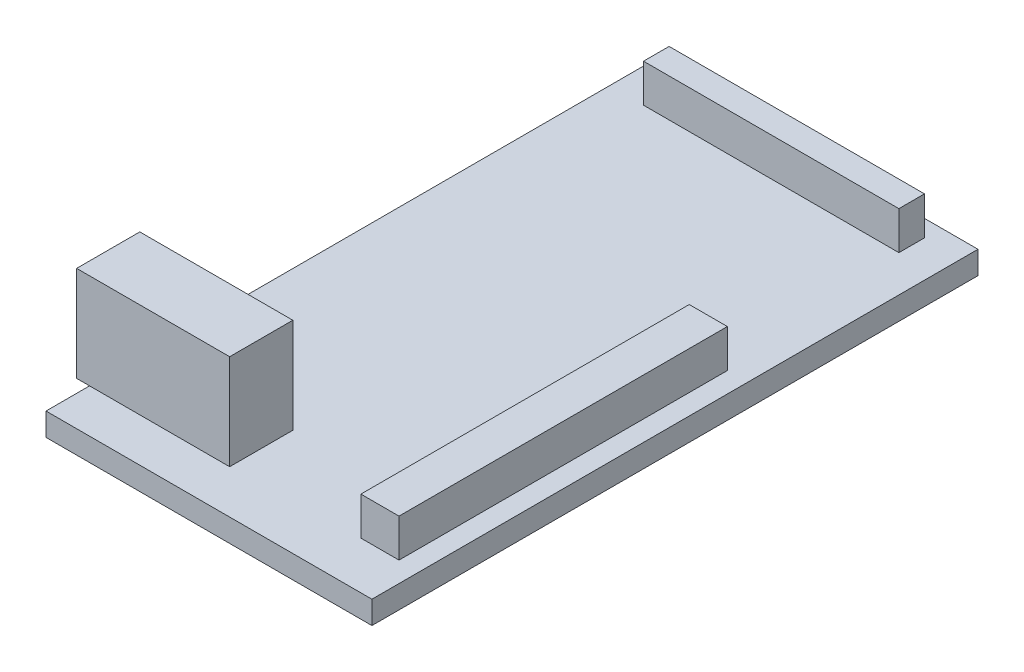
ISO-10303-21;
HEADER;
FILE_DESCRIPTION(('STEP AP214'),'2;1');
FILE_NAME('part.step','',(''),(''),'','','');
FILE_SCHEMA(('AUTOMOTIVE_DESIGN { 1 0 10303 214 1 1 1 1 }'));
ENDSEC;
DATA;
#1=APPLICATION_CONTEXT('core data for automotive mechanical design processes');
#2=APPLICATION_PROTOCOL_DEFINITION('international standard','automotive_design',2000,#1);
#3=PRODUCT_CONTEXT('',#1,'mechanical');
#4=PRODUCT('Part','Part','',(#3));
#5=PRODUCT_RELATED_PRODUCT_CATEGORY('part','',(#4));
#6=PRODUCT_DEFINITION_FORMATION('','',#4);
#7=PRODUCT_DEFINITION_CONTEXT('part definition',#1,'design');
#8=PRODUCT_DEFINITION('design','',#6,#7);
#9=PRODUCT_DEFINITION_SHAPE('','',#8);
#10=(LENGTH_UNIT() NAMED_UNIT(*) SI_UNIT(.MILLI.,.METRE.));
#11=(NAMED_UNIT(*) PLANE_ANGLE_UNIT() SI_UNIT($,.RADIAN.));
#12=(NAMED_UNIT(*) SI_UNIT($,.STERADIAN.) SOLID_ANGLE_UNIT());
#13=UNCERTAINTY_MEASURE_WITH_UNIT(LENGTH_MEASURE(1.E-05),#10,'distance_accuracy_value','');
#14=(GEOMETRIC_REPRESENTATION_CONTEXT(3) GLOBAL_UNCERTAINTY_ASSIGNED_CONTEXT((#13)) GLOBAL_UNIT_ASSIGNED_CONTEXT((#10,
#11,#12)) REPRESENTATION_CONTEXT('',''));
#15=CARTESIAN_POINT('',(0.,0.,0.));
#16=DIRECTION('',(0.,0.,1.));
#17=DIRECTION('',(1.,0.,0.));
#18=AXIS2_PLACEMENT_3D('',#15,#16,#17);
#19=CARTESIAN_POINT('',(0.,1.2,0.));
#20=DIRECTION('',(0.,1.,0.));
#21=DIRECTION('',(0.,0.,1.));
#22=AXIS2_PLACEMENT_3D('',#19,#20,#21);
#23=PLANE('',#22);
#24=DIRECTION('',(1.,0.,0.));
#25=VECTOR('',#24,1.);
#26=CARTESIAN_POINT('',(1.77870688865515,1.2,2.22884492076577));
#27=LINE('',#26,#25);
#28=CARTESIAN_POINT('',(1.77870688865515,1.2,2.22884492076577));
#29=VERTEX_POINT('',#28);
#30=CARTESIAN_POINT('',(15.1784388262954,1.2,2.22884492076577));
#31=VERTEX_POINT('',#30);
#32=EDGE_CURVE('E225',#29,#31,#27,.T.);
#33=ORIENTED_EDGE('',*,*,#32,.F.);
#34=DIRECTION('',(0.,0.,1.));
#35=VECTOR('',#34,1.);
#36=CARTESIAN_POINT('',(1.77870688865515,1.2,0.886014641300761));
#37=LINE('',#36,#35);
#38=CARTESIAN_POINT('',(1.77870688865515,1.2,0.886014641300761));
#39=VERTEX_POINT('',#38);
#40=EDGE_CURVE('E211',#39,#29,#37,.T.);
#41=ORIENTED_EDGE('',*,*,#40,.F.);
#42=DIRECTION('',(-1.,0.,0.));
#43=VECTOR('',#42,1.);
#44=CARTESIAN_POINT('',(1.77870688865515,1.2,0.886014641300761));
#45=LINE('',#44,#43);
#46=CARTESIAN_POINT('',(15.1784388262954,1.2,0.886014641300761));
#47=VERTEX_POINT('',#46);
#48=EDGE_CURVE('E216',#47,#39,#45,.T.);
#49=ORIENTED_EDGE('',*,*,#48,.F.);
#50=DIRECTION('',(0.,0.,-1.));
#51=VECTOR('',#50,1.);
#52=CARTESIAN_POINT('',(15.1784388262954,1.2,0.886014641300761));
#53=LINE('',#52,#51);
#54=EDGE_CURVE('E227',#31,#47,#53,.T.);
#55=ORIENTED_EDGE('',*,*,#54,.F.);
#56=EDGE_LOOP('',(#33,#41,#49,#55));
#57=FACE_BOUND('',#56,.T.);
#58=DIRECTION('',(1.,0.,0.));
#59=VECTOR('',#58,1.);
#60=CARTESIAN_POINT('',(14.0356045458996,1.2,29.3140173661452));
#61=LINE('',#60,#59);
#62=CARTESIAN_POINT('',(14.0356045458996,1.2,29.3140173661452));
#63=VERTEX_POINT('',#62);
#64=CARTESIAN_POINT('',(16.0355645365922,1.2,29.3140173661452));
#65=VERTEX_POINT('',#64);
#66=EDGE_CURVE('E180',#63,#65,#61,.T.);
#67=ORIENTED_EDGE('',*,*,#66,.F.);
#68=DIRECTION('',(0.,0.,1.));
#69=VECTOR('',#68,1.);
#70=CARTESIAN_POINT('',(14.0356045458996,1.2,12.0857905891792));
#71=LINE('',#70,#69);
#72=CARTESIAN_POINT('',(14.0356045458996,1.2,12.0857905891792));
#73=VERTEX_POINT('',#72);
#74=EDGE_CURVE('E177',#73,#63,#71,.T.);
#75=ORIENTED_EDGE('',*,*,#74,.F.);
#76=DIRECTION('',(-1.,0.,0.));
#77=VECTOR('',#76,1.);
#78=CARTESIAN_POINT('',(14.0356045458996,1.2,12.0857905891792));
#79=LINE('',#78,#77);
#80=CARTESIAN_POINT('',(16.0355645365922,1.2,12.0857905891792));
#81=VERTEX_POINT('',#80);
#82=EDGE_CURVE('E190',#81,#73,#79,.T.);
#83=ORIENTED_EDGE('',*,*,#82,.F.);
#84=DIRECTION('',(0.,0.,-1.));
#85=VECTOR('',#84,1.);
#86=CARTESIAN_POINT('',(16.0355645365922,1.2,12.0857905891792));
#87=LINE('',#86,#85);
#88=EDGE_CURVE('E198',#65,#81,#87,.T.);
#89=ORIENTED_EDGE('',*,*,#88,.F.);
#90=EDGE_LOOP('',(#67,#75,#83,#89));
#91=FACE_BOUND('',#90,.T.);
#92=DIRECTION('',(0.,0.,-1.));
#93=VECTOR('',#92,1.);
#94=CARTESIAN_POINT('',(7.35002400558446,1.2,26.1997939520667));
#95=LINE('',#94,#93);
#96=CARTESIAN_POINT('',(7.35002400558446,1.2,29.5140133652144));
#97=VERTEX_POINT('',#96);
#98=CARTESIAN_POINT('',(7.35002400558446,1.2,26.1997939520667));
#99=VERTEX_POINT('',#98);
#100=EDGE_CURVE('E48',#97,#99,#95,.T.);
#101=ORIENTED_EDGE('',*,*,#100,.F.);
#102=DIRECTION('',(1.,0.,0.));
#103=VECTOR('',#102,1.);
#104=CARTESIAN_POINT('',(-0.678386814195724,1.2,29.5140133652144));
#105=LINE('',#104,#103);
#106=CARTESIAN_POINT('',(0.,1.2,29.5140133652144));
#107=VERTEX_POINT('',#106);
#108=EDGE_CURVE('E301',#107,#97,#105,.T.);
#109=ORIENTED_EDGE('',*,*,#108,.F.);
#110=DIRECTION('',(0.,0.,1.));
#111=VECTOR('',#110,1.);
#112=CARTESIAN_POINT('',(0.,1.2,0.));
#113=LINE('',#112,#111);
#114=CARTESIAN_POINT('',(0.,1.2,31.8));
#115=VERTEX_POINT('',#114);
#116=EDGE_CURVE('E245',#107,#115,#113,.T.);
#117=ORIENTED_EDGE('',*,*,#116,.T.);
#118=DIRECTION('',(1.,0.,0.));
#119=VECTOR('',#118,1.);
#120=CARTESIAN_POINT('',(0.,1.2,31.8));
#121=LINE('',#120,#119);
#122=CARTESIAN_POINT('',(17.1,1.2,31.8));
#123=VERTEX_POINT('',#122);
#124=EDGE_CURVE('E243',#115,#123,#121,.T.);
#125=ORIENTED_EDGE('',*,*,#124,.T.);
#126=DIRECTION('',(0.,0.,-1.));
#127=VECTOR('',#126,1.);
#128=CARTESIAN_POINT('',(17.1,1.2,0.));
#129=LINE('',#128,#127);
#130=CARTESIAN_POINT('',(17.1,1.2,0.));
#131=VERTEX_POINT('',#130);
#132=EDGE_CURVE('E247',#123,#131,#129,.T.);
#133=ORIENTED_EDGE('',*,*,#132,.T.);
#134=DIRECTION('',(-1.,0.,0.));
#135=VECTOR('',#134,1.);
#136=CARTESIAN_POINT('',(0.,1.2,0.));
#137=LINE('',#136,#135);
#138=CARTESIAN_POINT('',(0.,1.2,0.));
#139=VERTEX_POINT('',#138);
#140=EDGE_CURVE('E249',#131,#139,#137,.T.);
#141=ORIENTED_EDGE('',*,*,#140,.T.);
#142=CARTESIAN_POINT('',(0.,1.2,26.1997939520667));
#143=VERTEX_POINT('',#142);
#144=EDGE_CURVE('E241',#139,#143,#113,.T.);
#145=ORIENTED_EDGE('',*,*,#144,.T.);
#146=DIRECTION('',(-1.,0.,0.));
#147=VECTOR('',#146,1.);
#148=CARTESIAN_POINT('',(-0.678386814195724,1.2,26.1997939520667));
#149=LINE('',#148,#147);
#150=EDGE_CURVE('E53',#99,#143,#149,.T.);
#151=ORIENTED_EDGE('',*,*,#150,.F.);
#152=EDGE_LOOP('',(#101,#109,#117,#125,#133,#141,#145,#151));
#153=FACE_BOUND('',#152,.T.);
#154=ADVANCED_FACE('F33',(#57,#91,#153),#23,.T.);
#155=CARTESIAN_POINT('',(0.,1.2,0.));
#156=DIRECTION('',(1.,0.,0.));
#157=DIRECTION('',(0.,0.,-1.));
#158=AXIS2_PLACEMENT_3D('',#155,#156,#157);
#159=PLANE('',#158);
#160=DIRECTION('',(0.,0.,1.));
#161=VECTOR('',#160,1.);
#162=CARTESIAN_POINT('',(0.,0.,0.));
#163=LINE('',#162,#161);
#164=CARTESIAN_POINT('',(0.,0.,0.));
#165=VERTEX_POINT('',#164);
#166=CARTESIAN_POINT('',(0.,0.,31.8));
#167=VERTEX_POINT('',#166);
#168=EDGE_CURVE('E240',#165,#167,#163,.T.);
#169=ORIENTED_EDGE('',*,*,#168,.T.);
#170=DIRECTION('',(0.,-1.,0.));
#171=VECTOR('',#170,1.);
#172=CARTESIAN_POINT('',(0.,1.2,31.8));
#173=LINE('',#172,#171);
#174=EDGE_CURVE('E11',#115,#167,#173,.T.);
#175=ORIENTED_EDGE('',*,*,#174,.F.);
#176=ORIENTED_EDGE('',*,*,#116,.F.);
#177=EDGE_CURVE('E244',#143,#107,#113,.T.);
#178=ORIENTED_EDGE('',*,*,#177,.F.);
#179=ORIENTED_EDGE('',*,*,#144,.F.);
#180=DIRECTION('',(0.,-1.,0.));
#181=VECTOR('',#180,1.);
#182=CARTESIAN_POINT('',(0.,1.2,0.));
#183=LINE('',#182,#181);
#184=EDGE_CURVE('E251',#139,#165,#183,.T.);
#185=ORIENTED_EDGE('',*,*,#184,.T.);
#186=EDGE_LOOP('',(#169,#175,#176,#178,#179,#185));
#187=FACE_BOUND('',#186,.T.);
#188=ADVANCED_FACE('F35',(#187),#159,.F.);
#189=CARTESIAN_POINT('',(0.,1.2,31.8));
#190=DIRECTION('',(0.,0.,-1.));
#191=DIRECTION('',(-1.,0.,0.));
#192=AXIS2_PLACEMENT_3D('',#189,#190,#191);
#193=PLANE('',#192);
#194=DIRECTION('',(1.,0.,0.));
#195=VECTOR('',#194,1.);
#196=CARTESIAN_POINT('',(0.,0.,31.8));
#197=LINE('',#196,#195);
#198=CARTESIAN_POINT('',(17.1,0.,31.8));
#199=VERTEX_POINT('',#198);
#200=EDGE_CURVE('E254',#167,#199,#197,.T.);
#201=ORIENTED_EDGE('',*,*,#200,.T.);
#202=DIRECTION('',(0.,-1.,0.));
#203=VECTOR('',#202,1.);
#204=CARTESIAN_POINT('',(17.1,1.2,31.8));
#205=LINE('',#204,#203);
#206=EDGE_CURVE('E41',#123,#199,#205,.T.);
#207=ORIENTED_EDGE('',*,*,#206,.F.);
#208=ORIENTED_EDGE('',*,*,#124,.F.);
#209=ORIENTED_EDGE('',*,*,#174,.T.);
#210=EDGE_LOOP('',(#201,#207,#208,#209));
#211=FACE_BOUND('',#210,.T.);
#212=ADVANCED_FACE('F320',(#211),#193,.F.);
#213=CARTESIAN_POINT('',(17.1,1.2,0.));
#214=DIRECTION('',(-1.,0.,0.));
#215=DIRECTION('',(0.,0.,1.));
#216=AXIS2_PLACEMENT_3D('',#213,#214,#215);
#217=PLANE('',#216);
#218=DIRECTION('',(0.,0.,-1.));
#219=VECTOR('',#218,1.);
#220=CARTESIAN_POINT('',(17.1,0.,0.));
#221=LINE('',#220,#219);
#222=CARTESIAN_POINT('',(17.1,0.,0.));
#223=VERTEX_POINT('',#222);
#224=EDGE_CURVE('E256',#199,#223,#221,.T.);
#225=ORIENTED_EDGE('',*,*,#224,.T.);
#226=DIRECTION('',(0.,-1.,0.));
#227=VECTOR('',#226,1.);
#228=CARTESIAN_POINT('',(17.1,1.2,0.));
#229=LINE('',#228,#227);
#230=EDGE_CURVE('E262',#131,#223,#229,.T.);
#231=ORIENTED_EDGE('',*,*,#230,.F.);
#232=ORIENTED_EDGE('',*,*,#132,.F.);
#233=ORIENTED_EDGE('',*,*,#206,.T.);
#234=EDGE_LOOP('',(#225,#231,#232,#233));
#235=FACE_BOUND('',#234,.T.);
#236=ADVANCED_FACE('F269',(#235),#217,.F.);
#237=CARTESIAN_POINT('',(0.,1.2,0.));
#238=DIRECTION('',(0.,0.,1.));
#239=DIRECTION('',(1.,0.,0.));
#240=AXIS2_PLACEMENT_3D('',#237,#238,#239);
#241=PLANE('',#240);
#242=DIRECTION('',(-1.,0.,0.));
#243=VECTOR('',#242,1.);
#244=CARTESIAN_POINT('',(0.,0.,0.));
#245=LINE('',#244,#243);
#246=EDGE_CURVE('E258',#223,#165,#245,.T.);
#247=ORIENTED_EDGE('',*,*,#246,.T.);
#248=ORIENTED_EDGE('',*,*,#184,.F.);
#249=ORIENTED_EDGE('',*,*,#140,.F.);
#250=ORIENTED_EDGE('',*,*,#230,.T.);
#251=EDGE_LOOP('',(#247,#248,#249,#250));
#252=FACE_BOUND('',#251,.T.);
#253=ADVANCED_FACE('F279',(#252),#241,.F.);
#254=CARTESIAN_POINT('',(0.,0.,0.));
#255=DIRECTION('',(0.,1.,0.));
#256=DIRECTION('',(0.,0.,1.));
#257=AXIS2_PLACEMENT_3D('',#254,#255,#256);
#258=PLANE('',#257);
#259=ORIENTED_EDGE('',*,*,#168,.F.);
#260=ORIENTED_EDGE('',*,*,#246,.F.);
#261=ORIENTED_EDGE('',*,*,#224,.F.);
#262=ORIENTED_EDGE('',*,*,#200,.F.);
#263=EDGE_LOOP('',(#259,#260,#261,#262));
#264=FACE_BOUND('',#263,.T.);
#265=ADVANCED_FACE('F276',(#264),#258,.F.);
#266=CARTESIAN_POINT('',(1.77870688865515,3.2,0.886014641300761));
#267=DIRECTION('',(1.,0.,0.));
#268=DIRECTION('',(0.,0.,-1.));
#269=AXIS2_PLACEMENT_3D('',#266,#267,#268);
#270=PLANE('',#269);
#271=ORIENTED_EDGE('',*,*,#40,.T.);
#272=DIRECTION('',(0.,-1.,0.));
#273=VECTOR('',#272,1.);
#274=CARTESIAN_POINT('',(1.77870688865515,3.2,2.22884492076577));
#275=LINE('',#274,#273);
#276=CARTESIAN_POINT('',(1.77870688865515,3.2,2.22884492076577));
#277=VERTEX_POINT('',#276);
#278=EDGE_CURVE('E238',#277,#29,#275,.T.);
#279=ORIENTED_EDGE('',*,*,#278,.F.);
#280=DIRECTION('',(0.,0.,1.));
#281=VECTOR('',#280,1.);
#282=CARTESIAN_POINT('',(1.77870688865515,3.2,0.886014641300761));
#283=LINE('',#282,#281);
#284=CARTESIAN_POINT('',(1.77870688865515,3.2,0.886014641300761));
#285=VERTEX_POINT('',#284);
#286=EDGE_CURVE('E212',#285,#277,#283,.T.);
#287=ORIENTED_EDGE('',*,*,#286,.F.);
#288=DIRECTION('',(0.,-1.,0.));
#289=VECTOR('',#288,1.);
#290=CARTESIAN_POINT('',(1.77870688865515,3.2,0.886014641300761));
#291=LINE('',#290,#289);
#292=EDGE_CURVE('E222',#285,#39,#291,.T.);
#293=ORIENTED_EDGE('',*,*,#292,.T.);
#294=EDGE_LOOP('',(#271,#279,#287,#293));
#295=FACE_BOUND('',#294,.T.);
#296=ADVANCED_FACE('F325',(#295),#270,.F.);
#297=CARTESIAN_POINT('',(1.77870688865515,3.2,2.22884492076577));
#298=DIRECTION('',(0.,0.,-1.));
#299=DIRECTION('',(-1.,0.,0.));
#300=AXIS2_PLACEMENT_3D('',#297,#298,#299);
#301=PLANE('',#300);
#302=ORIENTED_EDGE('',*,*,#32,.T.);
#303=DIRECTION('',(0.,-1.,0.));
#304=VECTOR('',#303,1.);
#305=CARTESIAN_POINT('',(15.1784388262954,3.2,2.22884492076577));
#306=LINE('',#305,#304);
#307=CARTESIAN_POINT('',(15.1784388262954,3.2,2.22884492076577));
#308=VERTEX_POINT('',#307);
#309=EDGE_CURVE('E235',#308,#31,#306,.T.);
#310=ORIENTED_EDGE('',*,*,#309,.F.);
#311=DIRECTION('',(1.,0.,0.));
#312=VECTOR('',#311,1.);
#313=CARTESIAN_POINT('',(1.77870688865515,3.2,2.22884492076577));
#314=LINE('',#313,#312);
#315=EDGE_CURVE('E215',#277,#308,#314,.T.);
#316=ORIENTED_EDGE('',*,*,#315,.F.);
#317=ORIENTED_EDGE('',*,*,#278,.T.);
#318=EDGE_LOOP('',(#302,#310,#316,#317));
#319=FACE_BOUND('',#318,.T.);
#320=ADVANCED_FACE('F356',(#319),#301,.F.);
#321=CARTESIAN_POINT('',(15.1784388262954,3.2,0.886014641300761));
#322=DIRECTION('',(-1.,0.,0.));
#323=DIRECTION('',(0.,0.,1.));
#324=AXIS2_PLACEMENT_3D('',#321,#322,#323);
#325=PLANE('',#324);
#326=ORIENTED_EDGE('',*,*,#54,.T.);
#327=DIRECTION('',(0.,-1.,0.));
#328=VECTOR('',#327,1.);
#329=CARTESIAN_POINT('',(15.1784388262954,3.2,0.886014641300761));
#330=LINE('',#329,#328);
#331=CARTESIAN_POINT('',(15.1784388262954,3.2,0.886014641300761));
#332=VERTEX_POINT('',#331);
#333=EDGE_CURVE('E233',#332,#47,#330,.T.);
#334=ORIENTED_EDGE('',*,*,#333,.F.);
#335=DIRECTION('',(0.,0.,-1.));
#336=VECTOR('',#335,1.);
#337=CARTESIAN_POINT('',(15.1784388262954,3.2,0.886014641300761));
#338=LINE('',#337,#336);
#339=EDGE_CURVE('E218',#308,#332,#338,.T.);
#340=ORIENTED_EDGE('',*,*,#339,.F.);
#341=ORIENTED_EDGE('',*,*,#309,.T.);
#342=EDGE_LOOP('',(#326,#334,#340,#341));
#343=FACE_BOUND('',#342,.T.);
#344=ADVANCED_FACE('F363',(#343),#325,.F.);
#345=CARTESIAN_POINT('',(1.77870688865515,3.2,0.886014641300761));
#346=DIRECTION('',(0.,0.,1.));
#347=DIRECTION('',(1.,0.,0.));
#348=AXIS2_PLACEMENT_3D('',#345,#346,#347);
#349=PLANE('',#348);
#350=ORIENTED_EDGE('',*,*,#48,.T.);
#351=ORIENTED_EDGE('',*,*,#292,.F.);
#352=DIRECTION('',(-1.,0.,0.));
#353=VECTOR('',#352,1.);
#354=CARTESIAN_POINT('',(1.77870688865515,3.2,0.886014641300761));
#355=LINE('',#354,#353);
#356=EDGE_CURVE('E220',#332,#285,#355,.T.);
#357=ORIENTED_EDGE('',*,*,#356,.F.);
#358=ORIENTED_EDGE('',*,*,#333,.T.);
#359=EDGE_LOOP('',(#350,#351,#357,#358));
#360=FACE_BOUND('',#359,.T.);
#361=ADVANCED_FACE('F370',(#360),#349,.F.);
#362=CARTESIAN_POINT('',(0.,3.2,0.));
#363=DIRECTION('',(0.,1.,0.));
#364=DIRECTION('',(0.,0.,1.));
#365=AXIS2_PLACEMENT_3D('',#362,#363,#364);
#366=PLANE('',#365);
#367=ORIENTED_EDGE('',*,*,#286,.T.);
#368=ORIENTED_EDGE('',*,*,#315,.T.);
#369=ORIENTED_EDGE('',*,*,#339,.T.);
#370=ORIENTED_EDGE('',*,*,#356,.T.);
#371=EDGE_LOOP('',(#367,#368,#369,#370));
#372=FACE_BOUND('',#371,.T.);
#373=ADVANCED_FACE('F378',(#372),#366,.T.);
#374=CARTESIAN_POINT('',(14.0356045458996,3.2,12.0857905891792));
#375=DIRECTION('',(1.,0.,0.));
#376=DIRECTION('',(0.,0.,-1.));
#377=AXIS2_PLACEMENT_3D('',#374,#375,#376);
#378=PLANE('',#377);
#379=ORIENTED_EDGE('',*,*,#74,.T.);
#380=DIRECTION('',(0.,-1.,0.));
#381=VECTOR('',#380,1.);
#382=CARTESIAN_POINT('',(14.0356045458996,3.2,29.3140173661452));
#383=LINE('',#382,#381);
#384=CARTESIAN_POINT('',(14.0356045458996,3.2,29.3140173661452));
#385=VERTEX_POINT('',#384);
#386=EDGE_CURVE('E209',#385,#63,#383,.T.);
#387=ORIENTED_EDGE('',*,*,#386,.F.);
#388=DIRECTION('',(0.,0.,1.));
#389=VECTOR('',#388,1.);
#390=CARTESIAN_POINT('',(14.0356045458996,3.2,12.0857905891792));
#391=LINE('',#390,#389);
#392=CARTESIAN_POINT('',(14.0356045458996,3.2,12.0857905891792));
#393=VERTEX_POINT('',#392);
#394=EDGE_CURVE('E186',#393,#385,#391,.T.);
#395=ORIENTED_EDGE('',*,*,#394,.F.);
#396=DIRECTION('',(0.,-1.,0.));
#397=VECTOR('',#396,1.);
#398=CARTESIAN_POINT('',(14.0356045458996,3.2,12.0857905891792));
#399=LINE('',#398,#397);
#400=EDGE_CURVE('E195',#393,#73,#399,.T.);
#401=ORIENTED_EDGE('',*,*,#400,.T.);
#402=EDGE_LOOP('',(#379,#387,#395,#401));
#403=FACE_BOUND('',#402,.T.);
#404=ADVANCED_FACE('F386',(#403),#378,.F.);
#405=CARTESIAN_POINT('',(14.0356045458996,3.2,29.3140173661452));
#406=DIRECTION('',(0.,0.,-1.));
#407=DIRECTION('',(-1.,0.,0.));
#408=AXIS2_PLACEMENT_3D('',#405,#406,#407);
#409=PLANE('',#408);
#410=ORIENTED_EDGE('',*,*,#66,.T.);
#411=DIRECTION('',(0.,-1.,0.));
#412=VECTOR('',#411,1.);
#413=CARTESIAN_POINT('',(16.0355645365922,3.2,29.3140173661452));
#414=LINE('',#413,#412);
#415=CARTESIAN_POINT('',(16.0355645365922,3.2,29.3140173661452));
#416=VERTEX_POINT('',#415);
#417=EDGE_CURVE('E206',#416,#65,#414,.T.);
#418=ORIENTED_EDGE('',*,*,#417,.F.);
#419=DIRECTION('',(1.,0.,0.));
#420=VECTOR('',#419,1.);
#421=CARTESIAN_POINT('',(14.0356045458996,3.2,29.3140173661452));
#422=LINE('',#421,#420);
#423=EDGE_CURVE('E189',#385,#416,#422,.T.);
#424=ORIENTED_EDGE('',*,*,#423,.F.);
#425=ORIENTED_EDGE('',*,*,#386,.T.);
#426=EDGE_LOOP('',(#410,#418,#424,#425));
#427=FACE_BOUND('',#426,.T.);
#428=ADVANCED_FACE('F394',(#427),#409,.F.);
#429=CARTESIAN_POINT('',(16.0355645365922,3.2,12.0857905891792));
#430=DIRECTION('',(-1.,0.,0.));
#431=DIRECTION('',(0.,0.,1.));
#432=AXIS2_PLACEMENT_3D('',#429,#430,#431);
#433=PLANE('',#432);
#434=ORIENTED_EDGE('',*,*,#88,.T.);
#435=DIRECTION('',(0.,-1.,0.));
#436=VECTOR('',#435,1.);
#437=CARTESIAN_POINT('',(16.0355645365922,3.2,12.0857905891792));
#438=LINE('',#437,#436);
#439=CARTESIAN_POINT('',(16.0355645365922,3.2,12.0857905891792));
#440=VERTEX_POINT('',#439);
#441=EDGE_CURVE('E204',#440,#81,#438,.T.);
#442=ORIENTED_EDGE('',*,*,#441,.F.);
#443=DIRECTION('',(0.,0.,-1.));
#444=VECTOR('',#443,1.);
#445=CARTESIAN_POINT('',(16.0355645365922,3.2,12.0857905891792));
#446=LINE('',#445,#444);
#447=EDGE_CURVE('E192',#416,#440,#446,.T.);
#448=ORIENTED_EDGE('',*,*,#447,.F.);
#449=ORIENTED_EDGE('',*,*,#417,.T.);
#450=EDGE_LOOP('',(#434,#442,#448,#449));
#451=FACE_BOUND('',#450,.T.);
#452=ADVANCED_FACE('F402',(#451),#433,.F.);
#453=CARTESIAN_POINT('',(14.0356045458996,3.2,12.0857905891792));
#454=DIRECTION('',(0.,0.,1.));
#455=DIRECTION('',(1.,0.,0.));
#456=AXIS2_PLACEMENT_3D('',#453,#454,#455);
#457=PLANE('',#456);
#458=ORIENTED_EDGE('',*,*,#82,.T.);
#459=ORIENTED_EDGE('',*,*,#400,.F.);
#460=DIRECTION('',(-1.,0.,0.));
#461=VECTOR('',#460,1.);
#462=CARTESIAN_POINT('',(14.0356045458996,3.2,12.0857905891792));
#463=LINE('',#462,#461);
#464=EDGE_CURVE('E194',#440,#393,#463,.T.);
#465=ORIENTED_EDGE('',*,*,#464,.F.);
#466=ORIENTED_EDGE('',*,*,#441,.T.);
#467=EDGE_LOOP('',(#458,#459,#465,#466));
#468=FACE_BOUND('',#467,.T.);
#469=ADVANCED_FACE('F410',(#468),#457,.F.);
#470=CARTESIAN_POINT('',(0.,3.2,0.));
#471=DIRECTION('',(0.,1.,0.));
#472=DIRECTION('',(0.,0.,1.));
#473=AXIS2_PLACEMENT_3D('',#470,#471,#472);
#474=PLANE('',#473);
#475=ORIENTED_EDGE('',*,*,#394,.T.);
#476=ORIENTED_EDGE('',*,*,#423,.T.);
#477=ORIENTED_EDGE('',*,*,#447,.T.);
#478=ORIENTED_EDGE('',*,*,#464,.T.);
#479=EDGE_LOOP('',(#475,#476,#477,#478));
#480=FACE_BOUND('',#479,.T.);
#481=ADVANCED_FACE('F418',(#480),#474,.T.);
#482=CARTESIAN_POINT('',(0.,1.2,0.));
#483=DIRECTION('',(0.,1.,0.));
#484=DIRECTION('',(0.,0.,1.));
#485=AXIS2_PLACEMENT_3D('',#482,#483,#484);
#486=PLANE('',#485);
#487=CARTESIAN_POINT('',(-0.678386814195724,1.2,26.1997939520667));
#488=VERTEX_POINT('',#487);
#489=EDGE_CURVE('E287',#143,#488,#149,.T.);
#490=ORIENTED_EDGE('',*,*,#489,.F.);
#491=ORIENTED_EDGE('',*,*,#177,.T.);
#492=CARTESIAN_POINT('',(-0.678386814195724,1.2,29.5140133652144));
#493=VERTEX_POINT('',#492);
#494=EDGE_CURVE('E302',#493,#107,#105,.T.);
#495=ORIENTED_EDGE('',*,*,#494,.F.);
#496=DIRECTION('',(0.,0.,1.));
#497=VECTOR('',#496,1.);
#498=CARTESIAN_POINT('',(-0.678386814195724,1.2,26.1997939520667));
#499=LINE('',#498,#497);
#500=EDGE_CURVE('E176',#488,#493,#499,.T.);
#501=ORIENTED_EDGE('',*,*,#500,.F.);
#502=EDGE_LOOP('',(#490,#491,#495,#501));
#503=FACE_BOUND('',#502,.T.);
#504=ADVANCED_FACE('F288',(#503),#486,.F.);
#505=CARTESIAN_POINT('',(-0.678386814195724,6.2,26.1997939520667));
#506=DIRECTION('',(1.,0.,0.));
#507=DIRECTION('',(0.,0.,-1.));
#508=AXIS2_PLACEMENT_3D('',#505,#506,#507);
#509=PLANE('',#508);
#510=ORIENTED_EDGE('',*,*,#500,.T.);
#511=DIRECTION('',(0.,-1.,0.));
#512=VECTOR('',#511,1.);
#513=CARTESIAN_POINT('',(-0.678386814195724,6.2,29.5140133652144));
#514=LINE('',#513,#512);
#515=CARTESIAN_POINT('',(-0.678386814195724,6.2,29.5140133652144));
#516=VERTEX_POINT('',#515);
#517=EDGE_CURVE('E157',#516,#493,#514,.T.);
#518=ORIENTED_EDGE('',*,*,#517,.F.);
#519=DIRECTION('',(0.,0.,1.));
#520=VECTOR('',#519,1.);
#521=CARTESIAN_POINT('',(-0.678386814195724,6.2,26.1997939520667));
#522=LINE('',#521,#520);
#523=CARTESIAN_POINT('',(-0.678386814195724,6.2,26.1997939520667));
#524=VERTEX_POINT('',#523);
#525=EDGE_CURVE('E164',#524,#516,#522,.T.);
#526=ORIENTED_EDGE('',*,*,#525,.F.);
#527=DIRECTION('',(0.,-1.,0.));
#528=VECTOR('',#527,1.);
#529=CARTESIAN_POINT('',(-0.678386814195724,6.2,26.1997939520667));
#530=LINE('',#529,#528);
#531=EDGE_CURVE('E297',#524,#488,#530,.T.);
#532=ORIENTED_EDGE('',*,*,#531,.T.);
#533=EDGE_LOOP('',(#510,#518,#526,#532));
#534=FACE_BOUND('',#533,.T.);
#535=ADVANCED_FACE('F174',(#534),#509,.F.);
#536=CARTESIAN_POINT('',(-0.678386814195724,6.2,29.5140133652144));
#537=DIRECTION('',(0.,0.,-1.));
#538=DIRECTION('',(-1.,0.,0.));
#539=AXIS2_PLACEMENT_3D('',#536,#537,#538);
#540=PLANE('',#539);
#541=ORIENTED_EDGE('',*,*,#494,.T.);
#542=ORIENTED_EDGE('',*,*,#108,.T.);
#543=DIRECTION('',(0.,-1.,0.));
#544=VECTOR('',#543,1.);
#545=CARTESIAN_POINT('',(7.35002400558446,6.2,29.5140133652144));
#546=LINE('',#545,#544);
#547=CARTESIAN_POINT('',(7.35002400558446,6.2,29.5140133652144));
#548=VERTEX_POINT('',#547);
#549=EDGE_CURVE('E160',#548,#97,#546,.T.);
#550=ORIENTED_EDGE('',*,*,#549,.F.);
#551=DIRECTION('',(1.,0.,0.));
#552=VECTOR('',#551,1.);
#553=CARTESIAN_POINT('',(-0.678386814195724,6.2,29.5140133652144));
#554=LINE('',#553,#552);
#555=EDGE_CURVE('E152',#516,#548,#554,.T.);
#556=ORIENTED_EDGE('',*,*,#555,.F.);
#557=ORIENTED_EDGE('',*,*,#517,.T.);
#558=EDGE_LOOP('',(#541,#542,#550,#556,#557));
#559=FACE_BOUND('',#558,.T.);
#560=ADVANCED_FACE('F155',(#559),#540,.F.);
#561=CARTESIAN_POINT('',(7.35002400558446,6.2,26.1997939520667));
#562=DIRECTION('',(-1.,0.,0.));
#563=DIRECTION('',(0.,0.,1.));
#564=AXIS2_PLACEMENT_3D('',#561,#562,#563);
#565=PLANE('',#564);
#566=ORIENTED_EDGE('',*,*,#100,.T.);
#567=DIRECTION('',(0.,-1.,0.));
#568=VECTOR('',#567,1.);
#569=CARTESIAN_POINT('',(7.35002400558446,6.2,26.1997939520667));
#570=LINE('',#569,#568);
#571=CARTESIAN_POINT('',(7.35002400558446,6.2,26.1997939520667));
#572=VERTEX_POINT('',#571);
#573=EDGE_CURVE('E182',#572,#99,#570,.T.);
#574=ORIENTED_EDGE('',*,*,#573,.F.);
#575=DIRECTION('',(0.,0.,-1.));
#576=VECTOR('',#575,1.);
#577=CARTESIAN_POINT('',(7.35002400558446,6.2,26.1997939520667));
#578=LINE('',#577,#576);
#579=EDGE_CURVE('E163',#548,#572,#578,.T.);
#580=ORIENTED_EDGE('',*,*,#579,.F.);
#581=ORIENTED_EDGE('',*,*,#549,.T.);
#582=EDGE_LOOP('',(#566,#574,#580,#581));
#583=FACE_BOUND('',#582,.T.);
#584=ADVANCED_FACE('F304',(#583),#565,.F.);
#585=CARTESIAN_POINT('',(-0.678386814195724,6.2,26.1997939520667));
#586=DIRECTION('',(0.,0.,1.));
#587=DIRECTION('',(1.,0.,0.));
#588=AXIS2_PLACEMENT_3D('',#585,#586,#587);
#589=PLANE('',#588);
#590=ORIENTED_EDGE('',*,*,#150,.T.);
#591=ORIENTED_EDGE('',*,*,#489,.T.);
#592=ORIENTED_EDGE('',*,*,#531,.F.);
#593=DIRECTION('',(-1.,0.,0.));
#594=VECTOR('',#593,1.);
#595=CARTESIAN_POINT('',(-0.678386814195724,6.2,26.1997939520667));
#596=LINE('',#595,#594);
#597=EDGE_CURVE('E169',#572,#524,#596,.T.);
#598=ORIENTED_EDGE('',*,*,#597,.F.);
#599=ORIENTED_EDGE('',*,*,#573,.T.);
#600=EDGE_LOOP('',(#590,#591,#592,#598,#599));
#601=FACE_BOUND('',#600,.T.);
#602=ADVANCED_FACE('F292',(#601),#589,.F.);
#603=CARTESIAN_POINT('',(0.,6.2,0.));
#604=DIRECTION('',(0.,1.,0.));
#605=DIRECTION('',(0.,0.,1.));
#606=AXIS2_PLACEMENT_3D('',#603,#604,#605);
#607=PLANE('',#606);
#608=ORIENTED_EDGE('',*,*,#525,.T.);
#609=ORIENTED_EDGE('',*,*,#555,.T.);
#610=ORIENTED_EDGE('',*,*,#579,.T.);
#611=ORIENTED_EDGE('',*,*,#597,.T.);
#612=EDGE_LOOP('',(#608,#609,#610,#611));
#613=FACE_BOUND('',#612,.T.);
#614=ADVANCED_FACE('F167',(#613),#607,.T.);
#615=CLOSED_SHELL('',(#154,#188,#212,#236,#253,#265,#296,#320,#344,#361,#373,#404,#428,#452,
#469,#481,#504,#535,#560,#584,#602,#614));
#616=MANIFOLD_SOLID_BREP('B2',#615);
#617=ADVANCED_BREP_SHAPE_REPRESENTATION('',(#18,#616),#14);
#618=SHAPE_DEFINITION_REPRESENTATION(#9,#617);
ENDSEC;
END-ISO-10303-21;
